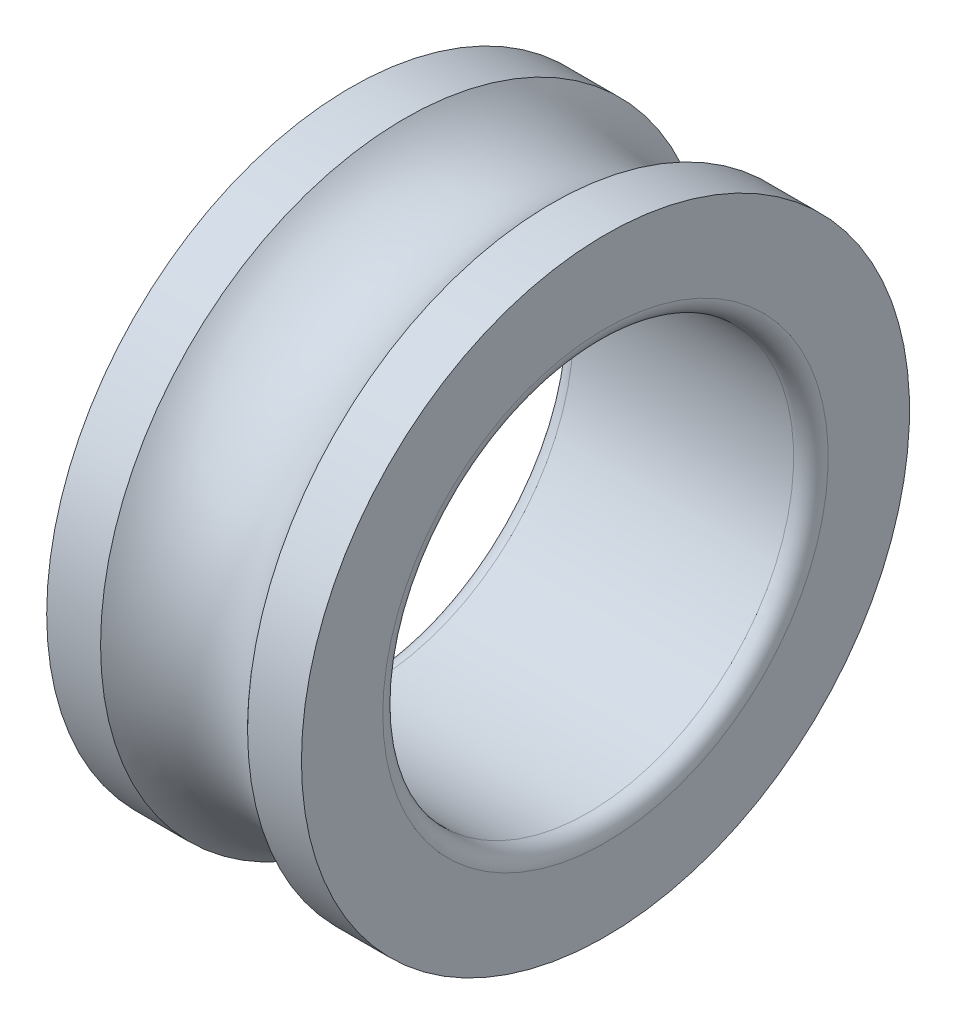
ISO-10303-21;
HEADER;
FILE_DESCRIPTION(('STEP AP214'),'2;1');
FILE_NAME('part.step','',(''),(''),'','','');
FILE_SCHEMA(('AUTOMOTIVE_DESIGN { 1 0 10303 214 1 1 1 1 }'));
ENDSEC;
DATA;
#1=APPLICATION_CONTEXT('core data for automotive mechanical design processes');
#2=APPLICATION_PROTOCOL_DEFINITION('international standard','automotive_design',2000,#1);
#3=PRODUCT_CONTEXT('',#1,'mechanical');
#4=PRODUCT('Part','Part','',(#3));
#5=PRODUCT_RELATED_PRODUCT_CATEGORY('part','',(#4));
#6=PRODUCT_DEFINITION_FORMATION('','',#4);
#7=PRODUCT_DEFINITION_CONTEXT('part definition',#1,'design');
#8=PRODUCT_DEFINITION('design','',#6,#7);
#9=PRODUCT_DEFINITION_SHAPE('','',#8);
#10=(LENGTH_UNIT() NAMED_UNIT(*) SI_UNIT(.MILLI.,.METRE.));
#11=(NAMED_UNIT(*) PLANE_ANGLE_UNIT() SI_UNIT($,.RADIAN.));
#12=(NAMED_UNIT(*) SI_UNIT($,.STERADIAN.) SOLID_ANGLE_UNIT());
#13=UNCERTAINTY_MEASURE_WITH_UNIT(LENGTH_MEASURE(1.E-05),#10,'distance_accuracy_value','');
#14=(GEOMETRIC_REPRESENTATION_CONTEXT(3) GLOBAL_UNCERTAINTY_ASSIGNED_CONTEXT((#13)) GLOBAL_UNIT_ASSIGNED_CONTEXT((#10,
#11,#12)) REPRESENTATION_CONTEXT('',''));
#15=CARTESIAN_POINT('',(0.,0.,0.));
#16=DIRECTION('',(0.,0.,1.));
#17=DIRECTION('',(1.,0.,0.));
#18=AXIS2_PLACEMENT_3D('',#15,#16,#17);
#19=CARTESIAN_POINT('',(-135.128205128205,0.,0.));
#20=DIRECTION('',(-1.,0.,0.));
#21=DIRECTION('',(0.,0.,1.));
#22=AXIS2_PLACEMENT_3D('',#19,#20,#21);
#23=CYLINDRICAL_SURFACE('',#22,370.);
#24=CARTESIAN_POINT('',(-155.,0.,0.));
#25=DIRECTION('',(-1.,0.,0.));
#26=DIRECTION('',(0.,0.,1.));
#27=AXIS2_PLACEMENT_3D('',#24,#25,#26);
#28=CIRCLE('',#27,370.);
#29=CARTESIAN_POINT('',(-155.,0.,370.));
#30=VERTEX_POINT('',#29);
#31=EDGE_CURVE('E61',#30,#30,#28,.T.);
#32=ORIENTED_EDGE('',*,*,#31,.F.);
#33=EDGE_LOOP('',(#32));
#34=FACE_BOUND('',#33,.T.);
#35=CARTESIAN_POINT('',(-89.4427190999917,0.,0.));
#36=DIRECTION('',(-1.,0.,0.));
#37=DIRECTION('',(0.,0.,1.));
#38=AXIS2_PLACEMENT_3D('',#35,#36,#37);
#39=CIRCLE('',#38,370.);
#40=CARTESIAN_POINT('',(-89.4427190999917,0.,370.));
#41=VERTEX_POINT('',#40);
#42=EDGE_CURVE('E10',#41,#41,#39,.T.);
#43=ORIENTED_EDGE('',*,*,#42,.T.);
#44=EDGE_LOOP('',(#43));
#45=FACE_BOUND('',#44,.T.);
#46=ADVANCED_FACE('F33',(#34,#45),#23,.T.);
#47=CARTESIAN_POINT('',(0.,0.,0.));
#48=DIRECTION('',(-1.,0.,0.));
#49=DIRECTION('',(0.,0.,1.));
#50=AXIS2_PLACEMENT_3D('',#47,#48,#49);
#51=TOROIDAL_SURFACE('',#50,450.,120.);
#52=ORIENTED_EDGE('',*,*,#42,.F.);
#53=EDGE_LOOP('',(#52));
#54=FACE_BOUND('',#53,.T.);
#55=CARTESIAN_POINT('',(89.4427190999916,0.,0.));
#56=DIRECTION('',(-1.,0.,0.));
#57=DIRECTION('',(0.,0.,1.));
#58=AXIS2_PLACEMENT_3D('',#55,#56,#57);
#59=CIRCLE('',#58,370.);
#60=CARTESIAN_POINT('',(89.4427190999916,0.,370.));
#61=VERTEX_POINT('',#60);
#62=EDGE_CURVE('E39',#61,#61,#59,.T.);
#63=ORIENTED_EDGE('',*,*,#62,.T.);
#64=EDGE_LOOP('',(#63));
#65=FACE_BOUND('',#64,.T.);
#66=ADVANCED_FACE('F68',(#54,#65),#51,.F.);
#67=CARTESIAN_POINT('',(-135.128205128205,0.,0.));
#68=DIRECTION('',(-1.,0.,0.));
#69=DIRECTION('',(0.,0.,1.));
#70=AXIS2_PLACEMENT_3D('',#67,#68,#69);
#71=CYLINDRICAL_SURFACE('',#70,370.);
#72=ORIENTED_EDGE('',*,*,#62,.F.);
#73=EDGE_LOOP('',(#72));
#74=FACE_BOUND('',#73,.T.);
#75=CARTESIAN_POINT('',(155.,0.,0.));
#76=DIRECTION('',(-1.,0.,0.));
#77=DIRECTION('',(0.,0.,1.));
#78=AXIS2_PLACEMENT_3D('',#75,#76,#77);
#79=CIRCLE('',#78,370.);
#80=CARTESIAN_POINT('',(155.,0.,370.));
#81=VERTEX_POINT('',#80);
#82=EDGE_CURVE('E43',#81,#81,#79,.T.);
#83=ORIENTED_EDGE('',*,*,#82,.T.);
#84=EDGE_LOOP('',(#83));
#85=FACE_BOUND('',#84,.T.);
#86=ADVANCED_FACE('F72',(#74,#85),#71,.T.);
#87=CARTESIAN_POINT('',(155.,271.,0.));
#88=DIRECTION('',(-1.,0.,0.));
#89=DIRECTION('',(0.,0.,1.));
#90=AXIS2_PLACEMENT_3D('',#87,#88,#89);
#91=PLANE('',#90);
#92=ORIENTED_EDGE('',*,*,#82,.F.);
#93=EDGE_LOOP('',(#92));
#94=FACE_BOUND('',#93,.T.);
#95=CARTESIAN_POINT('',(155.,0.,0.));
#96=DIRECTION('',(-1.,0.,0.));
#97=DIRECTION('',(0.,0.,1.));
#98=AXIS2_PLACEMENT_3D('',#95,#96,#97);
#99=CIRCLE('',#98,271.);
#100=CARTESIAN_POINT('',(155.,0.,271.));
#101=VERTEX_POINT('',#100);
#102=EDGE_CURVE('E47',#101,#101,#99,.T.);
#103=ORIENTED_EDGE('',*,*,#102,.T.);
#104=EDGE_LOOP('',(#103));
#105=FACE_BOUND('',#104,.T.);
#106=ADVANCED_FACE('F77',(#94,#105),#91,.F.);
#107=CARTESIAN_POINT('',(134.,0.,0.));
#108=DIRECTION('',(-1.,0.,0.));
#109=DIRECTION('',(0.,0.,1.));
#110=AXIS2_PLACEMENT_3D('',#107,#108,#109);
#111=TOROIDAL_SURFACE('',#110,271.,21.);
#112=ORIENTED_EDGE('',*,*,#102,.F.);
#113=EDGE_LOOP('',(#112));
#114=FACE_BOUND('',#113,.T.);
#115=CARTESIAN_POINT('',(134.,0.,0.));
#116=DIRECTION('',(-1.,0.,0.));
#117=DIRECTION('',(0.,0.,1.));
#118=AXIS2_PLACEMENT_3D('',#115,#116,#117);
#119=CIRCLE('',#118,250.);
#120=CARTESIAN_POINT('',(134.,0.,250.));
#121=VERTEX_POINT('',#120);
#122=EDGE_CURVE('E52',#121,#121,#119,.T.);
#123=ORIENTED_EDGE('',*,*,#122,.T.);
#124=EDGE_LOOP('',(#123));
#125=FACE_BOUND('',#124,.T.);
#126=ADVANCED_FACE('F83',(#114,#125),#111,.T.);
#127=CARTESIAN_POINT('',(-135.128205128205,0.,0.));
#128=DIRECTION('',(-1.,0.,0.));
#129=DIRECTION('',(0.,0.,1.));
#130=AXIS2_PLACEMENT_3D('',#127,#128,#129);
#131=CYLINDRICAL_SURFACE('',#130,250.);
#132=ORIENTED_EDGE('',*,*,#122,.F.);
#133=EDGE_LOOP('',(#132));
#134=FACE_BOUND('',#133,.T.);
#135=CARTESIAN_POINT('',(-134.,0.,0.));
#136=DIRECTION('',(-1.,0.,0.));
#137=DIRECTION('',(0.,0.,1.));
#138=AXIS2_PLACEMENT_3D('',#135,#136,#137);
#139=CIRCLE('',#138,250.);
#140=CARTESIAN_POINT('',(-134.,0.,250.));
#141=VERTEX_POINT('',#140);
#142=EDGE_CURVE('E55',#141,#141,#139,.T.);
#143=ORIENTED_EDGE('',*,*,#142,.T.);
#144=EDGE_LOOP('',(#143));
#145=FACE_BOUND('',#144,.T.);
#146=ADVANCED_FACE('F87',(#134,#145),#131,.F.);
#147=CARTESIAN_POINT('',(-134.,0.,0.));
#148=DIRECTION('',(-1.,0.,0.));
#149=DIRECTION('',(0.,0.,1.));
#150=AXIS2_PLACEMENT_3D('',#147,#148,#149);
#151=TOROIDAL_SURFACE('',#150,271.,21.);
#152=ORIENTED_EDGE('',*,*,#142,.F.);
#153=EDGE_LOOP('',(#152));
#154=FACE_BOUND('',#153,.T.);
#155=CARTESIAN_POINT('',(-155.,0.,0.));
#156=DIRECTION('',(-1.,0.,0.));
#157=DIRECTION('',(0.,0.,1.));
#158=AXIS2_PLACEMENT_3D('',#155,#156,#157);
#159=CIRCLE('',#158,271.);
#160=CARTESIAN_POINT('',(-155.,0.,271.));
#161=VERTEX_POINT('',#160);
#162=EDGE_CURVE('E58',#161,#161,#159,.T.);
#163=ORIENTED_EDGE('',*,*,#162,.T.);
#164=EDGE_LOOP('',(#163));
#165=FACE_BOUND('',#164,.T.);
#166=ADVANCED_FACE('F91',(#154,#165),#151,.T.);
#167=CARTESIAN_POINT('',(-155.,271.,0.));
#168=DIRECTION('',(1.,0.,0.));
#169=DIRECTION('',(0.,0.,-1.));
#170=AXIS2_PLACEMENT_3D('',#167,#168,#169);
#171=PLANE('',#170);
#172=ORIENTED_EDGE('',*,*,#162,.F.);
#173=EDGE_LOOP('',(#172));
#174=FACE_BOUND('',#173,.T.);
#175=ORIENTED_EDGE('',*,*,#31,.T.);
#176=EDGE_LOOP('',(#175));
#177=FACE_BOUND('',#176,.T.);
#178=ADVANCED_FACE('F65',(#174,#177),#171,.F.);
#179=CLOSED_SHELL('',(#46,#66,#86,#106,#126,#146,#166,#178));
#180=MANIFOLD_SOLID_BREP('B2',#179);
#181=ADVANCED_BREP_SHAPE_REPRESENTATION('',(#18,#180),#14);
#182=SHAPE_DEFINITION_REPRESENTATION(#9,#181);
ENDSEC;
END-ISO-10303-21;
